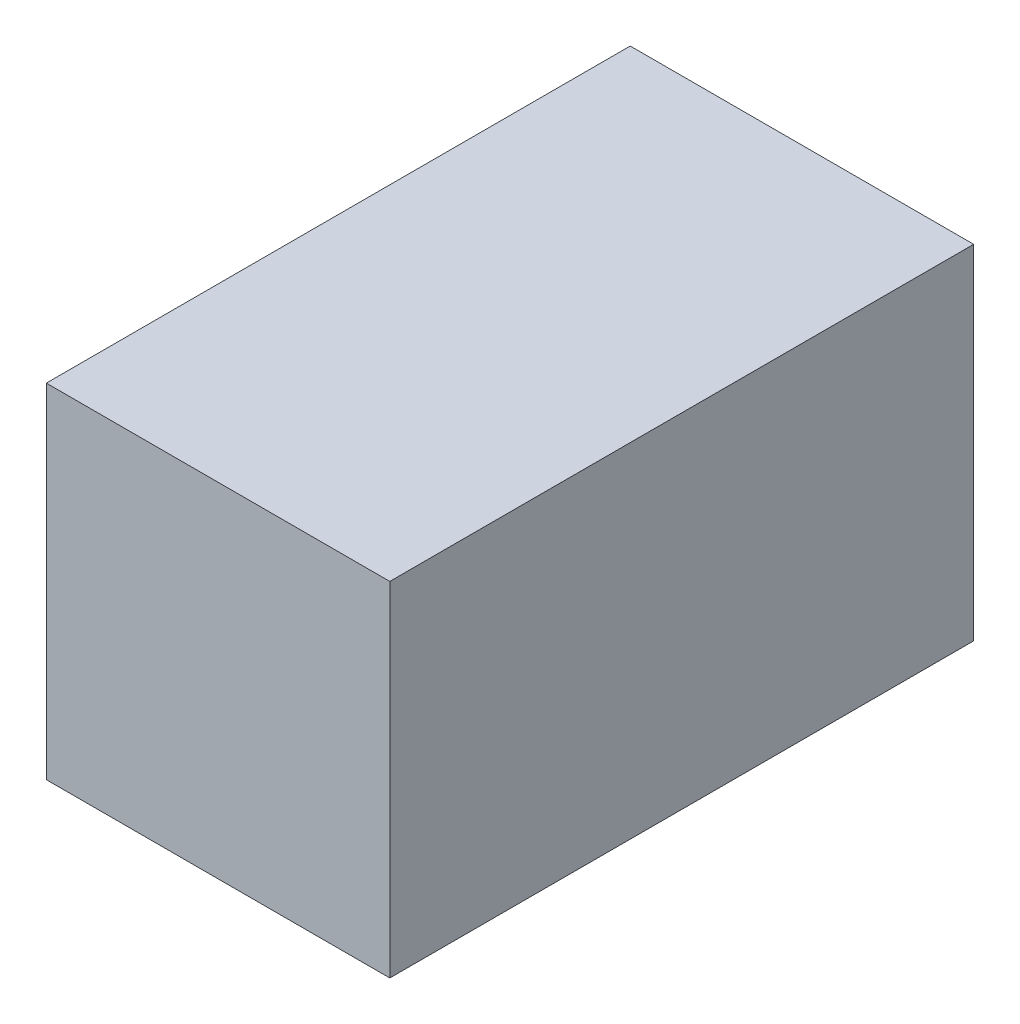
ISO-10303-21;
HEADER;
FILE_DESCRIPTION(('STEP AP214'),'2;1');
FILE_NAME('part.step','',(''),(''),'','','');
FILE_SCHEMA(('AUTOMOTIVE_DESIGN { 1 0 10303 214 1 1 1 1 }'));
ENDSEC;
DATA;
#1=APPLICATION_CONTEXT('core data for automotive mechanical design processes');
#2=APPLICATION_PROTOCOL_DEFINITION('international standard','automotive_design',2000,#1);
#3=PRODUCT_CONTEXT('',#1,'mechanical');
#4=PRODUCT('Part','Part','',(#3));
#5=PRODUCT_RELATED_PRODUCT_CATEGORY('part','',(#4));
#6=PRODUCT_DEFINITION_FORMATION('','',#4);
#7=PRODUCT_DEFINITION_CONTEXT('part definition',#1,'design');
#8=PRODUCT_DEFINITION('design','',#6,#7);
#9=PRODUCT_DEFINITION_SHAPE('','',#8);
#10=(LENGTH_UNIT() NAMED_UNIT(*) SI_UNIT(.MILLI.,.METRE.));
#11=(NAMED_UNIT(*) PLANE_ANGLE_UNIT() SI_UNIT($,.RADIAN.));
#12=(NAMED_UNIT(*) SI_UNIT($,.STERADIAN.) SOLID_ANGLE_UNIT());
#13=UNCERTAINTY_MEASURE_WITH_UNIT(LENGTH_MEASURE(1.E-05),#10,'distance_accuracy_value','');
#14=(GEOMETRIC_REPRESENTATION_CONTEXT(3) GLOBAL_UNCERTAINTY_ASSIGNED_CONTEXT((#13)) GLOBAL_UNIT_ASSIGNED_CONTEXT((#10,
#11,#12)) REPRESENTATION_CONTEXT('',''));
#15=CARTESIAN_POINT('',(0.,0.,0.));
#16=DIRECTION('',(0.,0.,1.));
#17=DIRECTION('',(1.,0.,0.));
#18=AXIS2_PLACEMENT_3D('',#15,#16,#17);
#19=CARTESIAN_POINT('',(100.,-100.,340.));
#20=DIRECTION('',(-1.,0.,0.));
#21=DIRECTION('',(0.,0.,1.));
#22=AXIS2_PLACEMENT_3D('',#19,#20,#21);
#23=PLANE('',#22);
#24=DIRECTION('',(0.,1.,0.));
#25=VECTOR('',#24,1.);
#26=CARTESIAN_POINT('',(100.,-100.,0.));
#27=LINE('',#26,#25);
#28=CARTESIAN_POINT('',(100.,-100.,0.));
#29=VERTEX_POINT('',#28);
#30=CARTESIAN_POINT('',(100.,100.,0.));
#31=VERTEX_POINT('',#30);
#32=EDGE_CURVE('E103',#29,#31,#27,.T.);
#33=ORIENTED_EDGE('',*,*,#32,.T.);
#34=DIRECTION('',(0.,0.,-1.));
#35=VECTOR('',#34,1.);
#36=CARTESIAN_POINT('',(100.,100.,340.));
#37=LINE('',#36,#35);
#38=CARTESIAN_POINT('',(100.,100.,340.));
#39=VERTEX_POINT('',#38);
#40=EDGE_CURVE('E11',#39,#31,#37,.T.);
#41=ORIENTED_EDGE('',*,*,#40,.F.);
#42=DIRECTION('',(0.,1.,0.));
#43=VECTOR('',#42,1.);
#44=CARTESIAN_POINT('',(100.,-100.,340.));
#45=LINE('',#44,#43);
#46=CARTESIAN_POINT('',(100.,-100.,340.));
#47=VERTEX_POINT('',#46);
#48=EDGE_CURVE('E91',#47,#39,#45,.T.);
#49=ORIENTED_EDGE('',*,*,#48,.F.);
#50=DIRECTION('',(0.,0.,-1.));
#51=VECTOR('',#50,1.);
#52=CARTESIAN_POINT('',(100.,-100.,340.));
#53=LINE('',#52,#51);
#54=EDGE_CURVE('E99',#47,#29,#53,.T.);
#55=ORIENTED_EDGE('',*,*,#54,.T.);
#56=EDGE_LOOP('',(#33,#41,#49,#55));
#57=FACE_BOUND('',#56,.T.);
#58=ADVANCED_FACE('F40',(#57),#23,.F.);
#59=CARTESIAN_POINT('',(-100.,100.,340.));
#60=DIRECTION('',(0.,-1.,0.));
#61=DIRECTION('',(0.,0.,-1.));
#62=AXIS2_PLACEMENT_3D('',#59,#60,#61);
#63=PLANE('',#62);
#64=DIRECTION('',(-1.,0.,0.));
#65=VECTOR('',#64,1.);
#66=CARTESIAN_POINT('',(-100.,100.,0.));
#67=LINE('',#66,#65);
#68=CARTESIAN_POINT('',(-100.,100.,0.));
#69=VERTEX_POINT('',#68);
#70=EDGE_CURVE('E95',#31,#69,#67,.T.);
#71=ORIENTED_EDGE('',*,*,#70,.T.);
#72=DIRECTION('',(0.,0.,-1.));
#73=VECTOR('',#72,1.);
#74=CARTESIAN_POINT('',(-100.,100.,340.));
#75=LINE('',#74,#73);
#76=CARTESIAN_POINT('',(-100.,100.,340.));
#77=VERTEX_POINT('',#76);
#78=EDGE_CURVE('E48',#77,#69,#75,.T.);
#79=ORIENTED_EDGE('',*,*,#78,.F.);
#80=DIRECTION('',(-1.,0.,0.));
#81=VECTOR('',#80,1.);
#82=CARTESIAN_POINT('',(-100.,100.,340.));
#83=LINE('',#82,#81);
#84=EDGE_CURVE('E86',#39,#77,#83,.T.);
#85=ORIENTED_EDGE('',*,*,#84,.F.);
#86=ORIENTED_EDGE('',*,*,#40,.T.);
#87=EDGE_LOOP('',(#71,#79,#85,#86));
#88=FACE_BOUND('',#87,.T.);
#89=ADVANCED_FACE('F94',(#88),#63,.F.);
#90=CARTESIAN_POINT('',(-100.,-100.,340.));
#91=DIRECTION('',(1.,0.,0.));
#92=DIRECTION('',(0.,0.,-1.));
#93=AXIS2_PLACEMENT_3D('',#90,#91,#92);
#94=PLANE('',#93);
#95=DIRECTION('',(0.,-1.,0.));
#96=VECTOR('',#95,1.);
#97=CARTESIAN_POINT('',(-100.,-100.,0.));
#98=LINE('',#97,#96);
#99=CARTESIAN_POINT('',(-100.,-100.,0.));
#100=VERTEX_POINT('',#99);
#101=EDGE_CURVE('E73',#69,#100,#98,.T.);
#102=ORIENTED_EDGE('',*,*,#101,.T.);
#103=DIRECTION('',(0.,0.,-1.));
#104=VECTOR('',#103,1.);
#105=CARTESIAN_POINT('',(-100.,-100.,340.));
#106=LINE('',#105,#104);
#107=CARTESIAN_POINT('',(-100.,-100.,340.));
#108=VERTEX_POINT('',#107);
#109=EDGE_CURVE('E96',#108,#100,#106,.T.);
#110=ORIENTED_EDGE('',*,*,#109,.F.);
#111=DIRECTION('',(0.,-1.,0.));
#112=VECTOR('',#111,1.);
#113=CARTESIAN_POINT('',(-100.,-100.,340.));
#114=LINE('',#113,#112);
#115=EDGE_CURVE('E89',#77,#108,#114,.T.);
#116=ORIENTED_EDGE('',*,*,#115,.F.);
#117=ORIENTED_EDGE('',*,*,#78,.T.);
#118=EDGE_LOOP('',(#102,#110,#116,#117));
#119=FACE_BOUND('',#118,.T.);
#120=ADVANCED_FACE('F97',(#119),#94,.F.);
#121=CARTESIAN_POINT('',(-100.,-100.,340.));
#122=DIRECTION('',(0.,1.,0.));
#123=DIRECTION('',(0.,0.,1.));
#124=AXIS2_PLACEMENT_3D('',#121,#122,#123);
#125=PLANE('',#124);
#126=DIRECTION('',(1.,0.,0.));
#127=VECTOR('',#126,1.);
#128=CARTESIAN_POINT('',(-100.,-100.,0.));
#129=LINE('',#128,#127);
#130=EDGE_CURVE('E79',#100,#29,#129,.T.);
#131=ORIENTED_EDGE('',*,*,#130,.T.);
#132=ORIENTED_EDGE('',*,*,#54,.F.);
#133=DIRECTION('',(1.,0.,0.));
#134=VECTOR('',#133,1.);
#135=CARTESIAN_POINT('',(-100.,-100.,340.));
#136=LINE('',#135,#134);
#137=EDGE_CURVE('E56',#108,#47,#136,.T.);
#138=ORIENTED_EDGE('',*,*,#137,.F.);
#139=ORIENTED_EDGE('',*,*,#109,.T.);
#140=EDGE_LOOP('',(#131,#132,#138,#139));
#141=FACE_BOUND('',#140,.T.);
#142=ADVANCED_FACE('F110',(#141),#125,.F.);
#143=CARTESIAN_POINT('',(0.,0.,340.));
#144=DIRECTION('',(0.,0.,-1.));
#145=DIRECTION('',(-1.,0.,0.));
#146=AXIS2_PLACEMENT_3D('',#143,#144,#145);
#147=PLANE('',#146);
#148=ORIENTED_EDGE('',*,*,#48,.T.);
#149=ORIENTED_EDGE('',*,*,#84,.T.);
#150=ORIENTED_EDGE('',*,*,#115,.T.);
#151=ORIENTED_EDGE('',*,*,#137,.T.);
#152=EDGE_LOOP('',(#148,#149,#150,#151));
#153=FACE_BOUND('',#152,.T.);
#154=ADVANCED_FACE('F87',(#153),#147,.F.);
#155=CARTESIAN_POINT('',(0.,0.,0.));
#156=DIRECTION('',(0.,0.,-1.));
#157=DIRECTION('',(-1.,0.,0.));
#158=AXIS2_PLACEMENT_3D('',#155,#156,#157);
#159=PLANE('',#158);
#160=ORIENTED_EDGE('',*,*,#32,.F.);
#161=ORIENTED_EDGE('',*,*,#130,.F.);
#162=ORIENTED_EDGE('',*,*,#101,.F.);
#163=ORIENTED_EDGE('',*,*,#70,.F.);
#164=EDGE_LOOP('',(#160,#161,#162,#163));
#165=FACE_BOUND('',#164,.T.);
#166=ADVANCED_FACE('F113',(#165),#159,.T.);
#167=CLOSED_SHELL('',(#58,#89,#120,#142,#154,#166));
#168=MANIFOLD_SOLID_BREP('B2',#167);
#169=ADVANCED_BREP_SHAPE_REPRESENTATION('',(#18,#168),#14);
#170=SHAPE_DEFINITION_REPRESENTATION(#9,#169);
ENDSEC;
END-ISO-10303-21;
